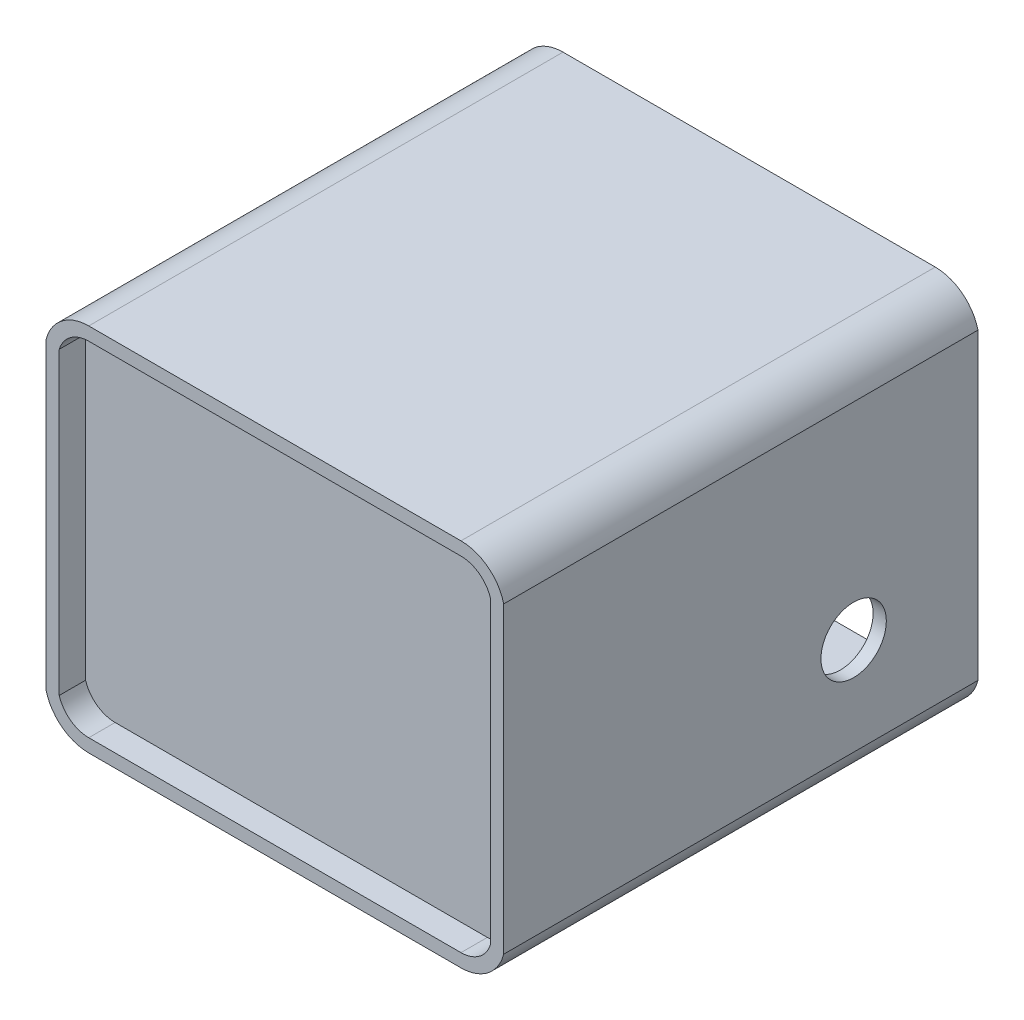
ISO-10303-21;
HEADER;
FILE_DESCRIPTION(('STEP AP214'),'2;1');
FILE_NAME('part.step','',(''),(''),'','','');
FILE_SCHEMA(('AUTOMOTIVE_DESIGN { 1 0 10303 214 1 1 1 1 }'));
ENDSEC;
DATA;
#1=APPLICATION_CONTEXT('core data for automotive mechanical design processes');
#2=APPLICATION_PROTOCOL_DEFINITION('international standard','automotive_design',2000,#1);
#3=PRODUCT_CONTEXT('',#1,'mechanical');
#4=PRODUCT('Part','Part','',(#3));
#5=PRODUCT_RELATED_PRODUCT_CATEGORY('part','',(#4));
#6=PRODUCT_DEFINITION_FORMATION('','',#4);
#7=PRODUCT_DEFINITION_CONTEXT('part definition',#1,'design');
#8=PRODUCT_DEFINITION('design','',#6,#7);
#9=PRODUCT_DEFINITION_SHAPE('','',#8);
#10=(LENGTH_UNIT() NAMED_UNIT(*) SI_UNIT(.MILLI.,.METRE.));
#11=(NAMED_UNIT(*) PLANE_ANGLE_UNIT() SI_UNIT($,.RADIAN.));
#12=(NAMED_UNIT(*) SI_UNIT($,.STERADIAN.) SOLID_ANGLE_UNIT());
#13=UNCERTAINTY_MEASURE_WITH_UNIT(LENGTH_MEASURE(1.E-05),#10,'distance_accuracy_value','');
#14=(GEOMETRIC_REPRESENTATION_CONTEXT(3) GLOBAL_UNCERTAINTY_ASSIGNED_CONTEXT((#13)) GLOBAL_UNIT_ASSIGNED_CONTEXT((#10,
#11,#12)) REPRESENTATION_CONTEXT('',''));
#15=CARTESIAN_POINT('',(0.,0.,0.));
#16=DIRECTION('',(0.,0.,1.));
#17=DIRECTION('',(1.,0.,0.));
#18=AXIS2_PLACEMENT_3D('',#15,#16,#17);
#19=CARTESIAN_POINT('',(-90.736928,619.21307254306,-231.201214));
#20=DIRECTION('',(0.,0.,1.));
#21=DIRECTION('',(1.,0.,0.));
#22=AXIS2_PLACEMENT_3D('',#19,#20,#21);
#23=CYLINDRICAL_SURFACE('',#22,15.0628965430605);
#24=CARTESIAN_POINT('',(-90.736928,619.21307254306,-19.202654));
#25=DIRECTION('',(0.,0.,1.));
#26=DIRECTION('',(1.,0.,0.));
#27=AXIS2_PLACEMENT_3D('',#24,#25,#26);
#28=CIRCLE('',#27,15.0628965430605);
#29=CARTESIAN_POINT('',(-90.736928,604.150176,-19.202654));
#30=VERTEX_POINT('',#29);
#31=CARTESIAN_POINT('',(-105.136188,614.791289676462,-19.202654));
#32=VERTEX_POINT('',#31);
#33=EDGE_CURVE('E213',#30,#32,#28,.F.);
#34=ORIENTED_EDGE('',*,*,#33,.F.);
#35=DIRECTION('',(0.,0.,1.));
#36=VECTOR('',#35,1.);
#37=CARTESIAN_POINT('',(-90.736928,604.150176,-231.201214));
#38=LINE('',#37,#36);
#39=CARTESIAN_POINT('',(-90.736928,604.150176,-231.201214));
#40=VERTEX_POINT('',#39);
#41=EDGE_CURVE('E197',#40,#30,#38,.T.);
#42=ORIENTED_EDGE('',*,*,#41,.F.);
#43=CARTESIAN_POINT('',(-90.736928,619.21307254306,-231.201214));
#44=DIRECTION('',(0.,0.,1.));
#45=DIRECTION('',(-1.,0.,0.));
#46=AXIS2_PLACEMENT_3D('',#43,#44,#45);
#47=CIRCLE('',#46,15.0628965430605);
#48=CARTESIAN_POINT('',(-105.136188,614.791289676462,-231.201214));
#49=VERTEX_POINT('',#48);
#50=EDGE_CURVE('E256',#49,#40,#47,.T.);
#51=ORIENTED_EDGE('',*,*,#50,.F.);
#52=DIRECTION('',(0.,0.,1.));
#53=VECTOR('',#52,1.);
#54=CARTESIAN_POINT('',(-105.136188,614.791289676462,-231.201214));
#55=LINE('',#54,#53);
#56=EDGE_CURVE('E214',#49,#32,#55,.T.);
#57=ORIENTED_EDGE('',*,*,#56,.T.);
#58=EDGE_LOOP('',(#34,#42,#51,#57));
#59=FACE_BOUND('',#58,.T.);
#60=ADVANCED_FACE('F35',(#59),#23,.F.);
#61=CARTESIAN_POINT('',(-105.136188,614.791289676462,-231.201214));
#62=DIRECTION('',(-1.,0.,0.));
#63=DIRECTION('',(0.,0.,1.));
#64=AXIS2_PLACEMENT_3D('',#61,#62,#63);
#65=PLANE('',#64);
#66=CARTESIAN_POINT('',(-105.136188,661.318972,-170.56862));
#67=DIRECTION('',(-1.,0.,0.));
#68=DIRECTION('',(0.,0.,1.));
#69=AXIS2_PLACEMENT_3D('',#66,#67,#68);
#70=CIRCLE('',#69,15.942437);
#71=CARTESIAN_POINT('',(-105.136188,661.318972,-154.626183));
#72=VERTEX_POINT('',#71);
#73=EDGE_CURVE('E236',#72,#72,#70,.T.);
#74=ORIENTED_EDGE('',*,*,#73,.T.);
#75=EDGE_LOOP('',(#74));
#76=FACE_BOUND('',#75,.T.);
#77=DIRECTION('',(0.,1.,0.));
#78=VECTOR('',#77,1.);
#79=CARTESIAN_POINT('',(-105.136188,0.,-19.202654));
#80=LINE('',#79,#78);
#81=CARTESIAN_POINT('',(-105.136188,760.916452345539,-19.202654));
#82=VERTEX_POINT('',#81);
#83=EDGE_CURVE('E52',#32,#82,#80,.T.);
#84=ORIENTED_EDGE('',*,*,#83,.F.);
#85=ORIENTED_EDGE('',*,*,#56,.F.);
#86=DIRECTION('',(0.,-1.,0.));
#87=VECTOR('',#86,1.);
#88=CARTESIAN_POINT('',(-105.136188,614.791289676462,-231.201214));
#89=LINE('',#88,#87);
#90=CARTESIAN_POINT('',(-105.136188,760.916452345539,-231.201214));
#91=VERTEX_POINT('',#90);
#92=EDGE_CURVE('E275',#91,#49,#89,.T.);
#93=ORIENTED_EDGE('',*,*,#92,.F.);
#94=DIRECTION('',(0.,0.,1.));
#95=VECTOR('',#94,1.);
#96=CARTESIAN_POINT('',(-105.136188,760.916452345539,-231.201214));
#97=LINE('',#96,#95);
#98=EDGE_CURVE('E303',#91,#82,#97,.T.);
#99=ORIENTED_EDGE('',*,*,#98,.T.);
#100=EDGE_LOOP('',(#84,#85,#93,#99));
#101=FACE_BOUND('',#100,.T.);
#102=ADVANCED_FACE('F424',(#76,#101),#65,.F.);
#103=CARTESIAN_POINT('',(-90.736928,756.494952551877,-231.201214));
#104=DIRECTION('',(0.,0.,1.));
#105=DIRECTION('',(1.,0.,0.));
#106=AXIS2_PLACEMENT_3D('',#103,#104,#105);
#107=CYLINDRICAL_SURFACE('',#106,15.0628134481229);
#108=CARTESIAN_POINT('',(-90.736928,756.494952551877,-19.202654));
#109=DIRECTION('',(0.,0.,1.));
#110=DIRECTION('',(1.,0.,0.));
#111=AXIS2_PLACEMENT_3D('',#108,#109,#110);
#112=CIRCLE('',#111,15.0628134481229);
#113=CARTESIAN_POINT('',(-90.736928,771.557766,-19.202654));
#114=VERTEX_POINT('',#113);
#115=EDGE_CURVE('E60',#82,#114,#112,.F.);
#116=ORIENTED_EDGE('',*,*,#115,.F.);
#117=ORIENTED_EDGE('',*,*,#98,.F.);
#118=CARTESIAN_POINT('',(-90.736928,756.494952551877,-231.201214));
#119=DIRECTION('',(0.,0.,1.));
#120=DIRECTION('',(-1.,0.,0.));
#121=AXIS2_PLACEMENT_3D('',#118,#119,#120);
#122=CIRCLE('',#121,15.0628134481229);
#123=CARTESIAN_POINT('',(-90.736928,771.557766,-231.201214));
#124=VERTEX_POINT('',#123);
#125=EDGE_CURVE('E272',#124,#91,#122,.T.);
#126=ORIENTED_EDGE('',*,*,#125,.F.);
#127=DIRECTION('',(0.,0.,1.));
#128=VECTOR('',#127,1.);
#129=CARTESIAN_POINT('',(-90.736928,771.557766,-231.201214));
#130=LINE('',#129,#128);
#131=EDGE_CURVE('E306',#124,#114,#130,.T.);
#132=ORIENTED_EDGE('',*,*,#131,.T.);
#133=EDGE_LOOP('',(#116,#117,#126,#132));
#134=FACE_BOUND('',#133,.T.);
#135=ADVANCED_FACE('F430',(#134),#107,.F.);
#136=CARTESIAN_POINT('',(-90.736928,771.557766,-231.201214));
#137=DIRECTION('',(0.,1.,0.));
#138=DIRECTION('',(-1.,0.,0.));
#139=AXIS2_PLACEMENT_3D('',#136,#137,#138);
#140=PLANE('',#139);
#141=DIRECTION('',(1.,0.,0.));
#142=VECTOR('',#141,1.);
#143=CARTESIAN_POINT('',(4.72064878796574E-13,771.557766,-19.202654));
#144=LINE('',#143,#142);
#145=CARTESIAN_POINT('',(90.721434,771.557766,-19.202654));
#146=VERTEX_POINT('',#145);
#147=EDGE_CURVE('E255',#114,#146,#144,.T.);
#148=ORIENTED_EDGE('',*,*,#147,.F.);
#149=ORIENTED_EDGE('',*,*,#131,.F.);
#150=DIRECTION('',(-1.,0.,0.));
#151=VECTOR('',#150,1.);
#152=CARTESIAN_POINT('',(-90.736928,771.557766,-231.201214));
#153=LINE('',#152,#151);
#154=CARTESIAN_POINT('',(90.721434,771.557766,-231.201214));
#155=VERTEX_POINT('',#154);
#156=EDGE_CURVE('E269',#155,#124,#153,.T.);
#157=ORIENTED_EDGE('',*,*,#156,.F.);
#158=DIRECTION('',(0.,0.,1.));
#159=VECTOR('',#158,1.);
#160=CARTESIAN_POINT('',(90.721434,771.557766,-231.201214));
#161=LINE('',#160,#159);
#162=EDGE_CURVE('E309',#155,#146,#161,.T.);
#163=ORIENTED_EDGE('',*,*,#162,.T.);
#164=EDGE_LOOP('',(#148,#149,#157,#163));
#165=FACE_BOUND('',#164,.T.);
#166=ADVANCED_FACE('F483',(#165),#140,.F.);
#167=CARTESIAN_POINT('',(90.721434,756.494625859581,-231.201214));
#168=DIRECTION('',(0.,0.,1.));
#169=DIRECTION('',(1.,0.,0.));
#170=AXIS2_PLACEMENT_3D('',#167,#168,#169);
#171=CYLINDRICAL_SURFACE('',#170,15.0631401404185);
#172=CARTESIAN_POINT('',(90.721434,756.494625859581,-19.202654));
#173=DIRECTION('',(0.,0.,1.));
#174=DIRECTION('',(1.,0.,0.));
#175=AXIS2_PLACEMENT_3D('',#172,#173,#174);
#176=CIRCLE('',#175,15.0631401404185);
#177=CARTESIAN_POINT('',(105.120948,760.916411409977,-19.202654));
#178=VERTEX_POINT('',#177);
#179=EDGE_CURVE('E228',#146,#178,#176,.F.);
#180=ORIENTED_EDGE('',*,*,#179,.F.);
#181=ORIENTED_EDGE('',*,*,#162,.F.);
#182=CARTESIAN_POINT('',(90.721434,756.494625859581,-231.201214));
#183=DIRECTION('',(0.,0.,1.));
#184=DIRECTION('',(-1.,0.,0.));
#185=AXIS2_PLACEMENT_3D('',#182,#183,#184);
#186=CIRCLE('',#185,15.0631401404185);
#187=CARTESIAN_POINT('',(105.120948,760.916411409977,-231.201214));
#188=VERTEX_POINT('',#187);
#189=EDGE_CURVE('E266',#188,#155,#186,.T.);
#190=ORIENTED_EDGE('',*,*,#189,.F.);
#191=DIRECTION('',(0.,0.,1.));
#192=VECTOR('',#191,1.);
#193=CARTESIAN_POINT('',(105.120948,760.916411409977,-231.201214));
#194=LINE('',#193,#192);
#195=EDGE_CURVE('E313',#188,#178,#194,.T.);
#196=ORIENTED_EDGE('',*,*,#195,.T.);
#197=EDGE_LOOP('',(#180,#181,#190,#196));
#198=FACE_BOUND('',#197,.T.);
#199=ADVANCED_FACE('F488',(#198),#171,.F.);
#200=CARTESIAN_POINT('',(105.120948,614.791330611854,-231.201214));
#201=DIRECTION('',(1.,0.,0.));
#202=DIRECTION('',(0.,0.,-1.));
#203=AXIS2_PLACEMENT_3D('',#200,#201,#202);
#204=PLANE('',#203);
#205=CARTESIAN_POINT('',(105.120948,661.318972,-170.56862));
#206=DIRECTION('',(1.,0.,0.));
#207=DIRECTION('',(0.,0.,-1.));
#208=AXIS2_PLACEMENT_3D('',#205,#206,#207);
#209=CIRCLE('',#208,15.942437);
#210=CARTESIAN_POINT('',(105.120948,661.318972,-186.511057));
#211=VERTEX_POINT('',#210);
#212=EDGE_CURVE('E529',#211,#211,#209,.T.);
#213=ORIENTED_EDGE('',*,*,#212,.T.);
#214=EDGE_LOOP('',(#213));
#215=FACE_BOUND('',#214,.T.);
#216=DIRECTION('',(0.,1.,0.));
#217=VECTOR('',#216,1.);
#218=CARTESIAN_POINT('',(105.120948,0.,-19.202654));
#219=LINE('',#218,#217);
#220=CARTESIAN_POINT('',(105.120948,614.791330611854,-19.202654));
#221=VERTEX_POINT('',#220);
#222=EDGE_CURVE('E223',#221,#178,#219,.T.);
#223=ORIENTED_EDGE('',*,*,#222,.T.);
#224=ORIENTED_EDGE('',*,*,#195,.F.);
#225=DIRECTION('',(0.,1.,0.));
#226=VECTOR('',#225,1.);
#227=CARTESIAN_POINT('',(105.120948,614.791330611854,-231.201214));
#228=LINE('',#227,#226);
#229=CARTESIAN_POINT('',(105.120948,614.791330611854,-231.201214));
#230=VERTEX_POINT('',#229);
#231=EDGE_CURVE('E263',#230,#188,#228,.T.);
#232=ORIENTED_EDGE('',*,*,#231,.F.);
#233=DIRECTION('',(0.,0.,1.));
#234=VECTOR('',#233,1.);
#235=CARTESIAN_POINT('',(105.120948,614.791330611854,-231.201214));
#236=LINE('',#235,#234);
#237=EDGE_CURVE('E317',#230,#221,#236,.T.);
#238=ORIENTED_EDGE('',*,*,#237,.T.);
#239=EDGE_LOOP('',(#223,#224,#232,#238));
#240=FACE_BOUND('',#239,.T.);
#241=ADVANCED_FACE('F493',(#215,#240),#204,.F.);
#242=CARTESIAN_POINT('',(90.721434,619.213399240477,-231.201214));
#243=DIRECTION('',(0.,0.,1.));
#244=DIRECTION('',(1.,0.,0.));
#245=AXIS2_PLACEMENT_3D('',#242,#243,#244);
#246=CYLINDRICAL_SURFACE('',#245,15.0632232404772);
#247=CARTESIAN_POINT('',(90.721434,619.213399240477,-19.202654));
#248=DIRECTION('',(0.,0.,1.));
#249=DIRECTION('',(1.,0.,0.));
#250=AXIS2_PLACEMENT_3D('',#247,#248,#249);
#251=CIRCLE('',#250,15.0632232404772);
#252=CARTESIAN_POINT('',(90.721434,604.150176,-19.202654));
#253=VERTEX_POINT('',#252);
#254=EDGE_CURVE('E221',#221,#253,#251,.F.);
#255=ORIENTED_EDGE('',*,*,#254,.F.);
#256=ORIENTED_EDGE('',*,*,#237,.F.);
#257=CARTESIAN_POINT('',(90.721434,619.213399240477,-231.201214));
#258=DIRECTION('',(0.,0.,1.));
#259=DIRECTION('',(-1.,0.,0.));
#260=AXIS2_PLACEMENT_3D('',#257,#258,#259);
#261=CIRCLE('',#260,15.0632232404772);
#262=CARTESIAN_POINT('',(90.721434,604.150176,-231.201214));
#263=VERTEX_POINT('',#262);
#264=EDGE_CURVE('E260',#263,#230,#261,.T.);
#265=ORIENTED_EDGE('',*,*,#264,.F.);
#266=DIRECTION('',(0.,0.,1.));
#267=VECTOR('',#266,1.);
#268=CARTESIAN_POINT('',(90.721434,604.150176,-231.201214));
#269=LINE('',#268,#267);
#270=EDGE_CURVE('E321',#263,#253,#269,.T.);
#271=ORIENTED_EDGE('',*,*,#270,.T.);
#272=EDGE_LOOP('',(#255,#256,#265,#271));
#273=FACE_BOUND('',#272,.T.);
#274=ADVANCED_FACE('F501',(#273),#246,.F.);
#275=CARTESIAN_POINT('',(-90.736928,604.150176,-231.201214));
#276=DIRECTION('',(0.,-1.,0.));
#277=DIRECTION('',(0.,0.,-1.));
#278=AXIS2_PLACEMENT_3D('',#275,#276,#277);
#279=PLANE('',#278);
#280=DIRECTION('',(1.,0.,0.));
#281=VECTOR('',#280,1.);
#282=CARTESIAN_POINT('',(0.,604.150176,-19.202654));
#283=LINE('',#282,#281);
#284=EDGE_CURVE('E202',#30,#253,#283,.T.);
#285=ORIENTED_EDGE('',*,*,#284,.T.);
#286=ORIENTED_EDGE('',*,*,#270,.F.);
#287=DIRECTION('',(1.,0.,0.));
#288=VECTOR('',#287,1.);
#289=CARTESIAN_POINT('',(-90.736928,604.150176,-231.201214));
#290=LINE('',#289,#288);
#291=EDGE_CURVE('E205',#40,#263,#290,.T.);
#292=ORIENTED_EDGE('',*,*,#291,.F.);
#293=ORIENTED_EDGE('',*,*,#41,.T.);
#294=EDGE_LOOP('',(#285,#286,#292,#293));
#295=FACE_BOUND('',#294,.T.);
#296=ADVANCED_FACE('F199',(#295),#279,.F.);
#297=CARTESIAN_POINT('',(-90.736928,619.21307254306,-231.201214));
#298=DIRECTION('',(0.,0.,1.));
#299=DIRECTION('',(1.,0.,0.));
#300=AXIS2_PLACEMENT_3D('',#297,#298,#299);
#301=CYLINDRICAL_SURFACE('',#300,21.5048445430605);
#302=CARTESIAN_POINT('',(-90.736928,619.21307254306,0.));
#303=DIRECTION('',(0.,0.,1.));
#304=DIRECTION('',(-1.,0.,0.));
#305=AXIS2_PLACEMENT_3D('',#302,#303,#304);
#306=CIRCLE('',#305,21.5048445430605);
#307=CARTESIAN_POINT('',(-111.578136,613.911904,0.));
#308=VERTEX_POINT('',#307);
#309=CARTESIAN_POINT('',(-90.736928,597.708228,0.));
#310=VERTEX_POINT('',#309);
#311=EDGE_CURVE('E301',#308,#310,#306,.T.);
#312=ORIENTED_EDGE('',*,*,#311,.F.);
#313=DIRECTION('',(0.,0.,1.));
#314=VECTOR('',#313,1.);
#315=CARTESIAN_POINT('',(-111.578136,613.911904,-231.201214));
#316=LINE('',#315,#314);
#317=CARTESIAN_POINT('',(-111.578136,613.911904,-231.201214));
#318=VERTEX_POINT('',#317);
#319=EDGE_CURVE('E11',#318,#308,#316,.T.);
#320=ORIENTED_EDGE('',*,*,#319,.F.);
#321=CARTESIAN_POINT('',(-90.736928,619.21307254306,-231.201214));
#322=DIRECTION('',(0.,0.,1.));
#323=DIRECTION('',(-1.,0.,0.));
#324=AXIS2_PLACEMENT_3D('',#321,#322,#323);
#325=CIRCLE('',#324,21.5048445430605);
#326=CARTESIAN_POINT('',(-90.736928,597.708228,-231.201214));
#327=VERTEX_POINT('',#326);
#328=EDGE_CURVE('E323',#318,#327,#325,.T.);
#329=ORIENTED_EDGE('',*,*,#328,.T.);
#330=DIRECTION('',(0.,0.,1.));
#331=VECTOR('',#330,1.);
#332=CARTESIAN_POINT('',(-90.736928,597.708228,-231.201214));
#333=LINE('',#332,#331);
#334=EDGE_CURVE('E39',#327,#310,#333,.T.);
#335=ORIENTED_EDGE('',*,*,#334,.T.);
#336=EDGE_LOOP('',(#312,#320,#329,#335));
#337=FACE_BOUND('',#336,.T.);
#338=ADVANCED_FACE('F37',(#337),#301,.T.);
#339=CARTESIAN_POINT('',(-111.578136,613.911904,-231.201214));
#340=DIRECTION('',(-1.,0.,0.));
#341=DIRECTION('',(0.,0.,1.));
#342=AXIS2_PLACEMENT_3D('',#339,#340,#341);
#343=PLANE('',#342);
#344=CARTESIAN_POINT('',(-111.578136,661.318972,-170.56862));
#345=DIRECTION('',(1.,0.,0.));
#346=DIRECTION('',(0.,0.,-1.));
#347=AXIS2_PLACEMENT_3D('',#344,#345,#346);
#348=CIRCLE('',#347,15.942437);
#349=CARTESIAN_POINT('',(-111.578136,661.318972,-186.511057));
#350=VERTEX_POINT('',#349);
#351=EDGE_CURVE('E532',#350,#350,#348,.T.);
#352=ORIENTED_EDGE('',*,*,#351,.T.);
#353=EDGE_LOOP('',(#352));
#354=FACE_BOUND('',#353,.T.);
#355=DIRECTION('',(0.,-1.,0.));
#356=VECTOR('',#355,1.);
#357=CARTESIAN_POINT('',(-111.578136,613.911904,0.));
#358=LINE('',#357,#356);
#359=CARTESIAN_POINT('',(-111.578136,761.795784,0.));
#360=VERTEX_POINT('',#359);
#361=EDGE_CURVE('E327',#360,#308,#358,.T.);
#362=ORIENTED_EDGE('',*,*,#361,.F.);
#363=DIRECTION('',(0.,0.,1.));
#364=VECTOR('',#363,1.);
#365=CARTESIAN_POINT('',(-111.578136,761.795784,-231.201214));
#366=LINE('',#365,#364);
#367=CARTESIAN_POINT('',(-111.578136,761.795784,-231.201214));
#368=VERTEX_POINT('',#367);
#369=EDGE_CURVE('E44',#368,#360,#366,.T.);
#370=ORIENTED_EDGE('',*,*,#369,.F.);
#371=DIRECTION('',(0.,-1.,0.));
#372=VECTOR('',#371,1.);
#373=CARTESIAN_POINT('',(-111.578136,613.911904,-231.201214));
#374=LINE('',#373,#372);
#375=EDGE_CURVE('E345',#368,#318,#374,.T.);
#376=ORIENTED_EDGE('',*,*,#375,.T.);
#377=ORIENTED_EDGE('',*,*,#319,.T.);
#378=EDGE_LOOP('',(#362,#370,#376,#377));
#379=FACE_BOUND('',#378,.T.);
#380=ADVANCED_FACE('F392',(#354,#379),#343,.T.);
#381=CARTESIAN_POINT('',(-90.736928,756.494952551877,-231.201214));
#382=DIRECTION('',(0.,0.,1.));
#383=DIRECTION('',(1.,0.,0.));
#384=AXIS2_PLACEMENT_3D('',#381,#382,#383);
#385=CYLINDRICAL_SURFACE('',#384,21.5047614481229);
#386=CARTESIAN_POINT('',(-90.736928,756.494952551877,0.));
#387=DIRECTION('',(0.,0.,1.));
#388=DIRECTION('',(-1.,0.,0.));
#389=AXIS2_PLACEMENT_3D('',#386,#387,#388);
#390=CIRCLE('',#389,21.5047614481229);
#391=CARTESIAN_POINT('',(-90.736928,777.999714,0.));
#392=VERTEX_POINT('',#391);
#393=EDGE_CURVE('E365',#392,#360,#390,.T.);
#394=ORIENTED_EDGE('',*,*,#393,.F.);
#395=DIRECTION('',(0.,0.,1.));
#396=VECTOR('',#395,1.);
#397=CARTESIAN_POINT('',(-90.736928,777.999714,-231.201214));
#398=LINE('',#397,#396);
#399=CARTESIAN_POINT('',(-90.736928,777.999714,-231.201214));
#400=VERTEX_POINT('',#399);
#401=EDGE_CURVE('E371',#400,#392,#398,.T.);
#402=ORIENTED_EDGE('',*,*,#401,.F.);
#403=CARTESIAN_POINT('',(-90.736928,756.494952551877,-231.201214));
#404=DIRECTION('',(0.,0.,1.));
#405=DIRECTION('',(-1.,0.,0.));
#406=AXIS2_PLACEMENT_3D('',#403,#404,#405);
#407=CIRCLE('',#406,21.5047614481229);
#408=EDGE_CURVE('E342',#400,#368,#407,.T.);
#409=ORIENTED_EDGE('',*,*,#408,.T.);
#410=ORIENTED_EDGE('',*,*,#369,.T.);
#411=EDGE_LOOP('',(#394,#402,#409,#410));
#412=FACE_BOUND('',#411,.T.);
#413=ADVANCED_FACE('F413',(#412),#385,.T.);
#414=CARTESIAN_POINT('',(-90.736928,777.999714,-231.201214));
#415=DIRECTION('',(0.,1.,0.));
#416=DIRECTION('',(0.,0.,1.));
#417=AXIS2_PLACEMENT_3D('',#414,#415,#416);
#418=PLANE('',#417);
#419=DIRECTION('',(-1.,0.,0.));
#420=VECTOR('',#419,1.);
#421=CARTESIAN_POINT('',(-90.736928,777.999714,0.));
#422=LINE('',#421,#420);
#423=CARTESIAN_POINT('',(90.721434,777.999714,0.));
#424=VERTEX_POINT('',#423);
#425=EDGE_CURVE('E362',#424,#392,#422,.T.);
#426=ORIENTED_EDGE('',*,*,#425,.F.);
#427=DIRECTION('',(0.,0.,1.));
#428=VECTOR('',#427,1.);
#429=CARTESIAN_POINT('',(90.721434,777.999714,-231.201214));
#430=LINE('',#429,#428);
#431=CARTESIAN_POINT('',(90.721434,777.999714,-231.201214));
#432=VERTEX_POINT('',#431);
#433=EDGE_CURVE('E373',#432,#424,#430,.T.);
#434=ORIENTED_EDGE('',*,*,#433,.F.);
#435=DIRECTION('',(-1.,0.,0.));
#436=VECTOR('',#435,1.);
#437=CARTESIAN_POINT('',(-90.736928,777.999714,-231.201214));
#438=LINE('',#437,#436);
#439=EDGE_CURVE('E339',#432,#400,#438,.T.);
#440=ORIENTED_EDGE('',*,*,#439,.T.);
#441=ORIENTED_EDGE('',*,*,#401,.T.);
#442=EDGE_LOOP('',(#426,#434,#440,#441));
#443=FACE_BOUND('',#442,.T.);
#444=ADVANCED_FACE('F411',(#443),#418,.T.);
#445=CARTESIAN_POINT('',(90.721434,756.494625859581,-231.201214));
#446=DIRECTION('',(0.,0.,1.));
#447=DIRECTION('',(1.,0.,0.));
#448=AXIS2_PLACEMENT_3D('',#445,#446,#447);
#449=CYLINDRICAL_SURFACE('',#448,21.5050881404186);
#450=CARTESIAN_POINT('',(90.721434,756.494625859581,0.));
#451=DIRECTION('',(0.,0.,1.));
#452=DIRECTION('',(-1.,0.,0.));
#453=AXIS2_PLACEMENT_3D('',#450,#451,#452);
#454=CIRCLE('',#453,21.5050881404186);
#455=CARTESIAN_POINT('',(111.562896,761.795784,0.));
#456=VERTEX_POINT('',#455);
#457=EDGE_CURVE('E359',#456,#424,#454,.T.);
#458=ORIENTED_EDGE('',*,*,#457,.F.);
#459=DIRECTION('',(0.,0.,1.));
#460=VECTOR('',#459,1.);
#461=CARTESIAN_POINT('',(111.562896,761.795784,-231.201214));
#462=LINE('',#461,#460);
#463=CARTESIAN_POINT('',(111.562896,761.795784,-231.201214));
#464=VERTEX_POINT('',#463);
#465=EDGE_CURVE('E375',#464,#456,#462,.T.);
#466=ORIENTED_EDGE('',*,*,#465,.F.);
#467=CARTESIAN_POINT('',(90.721434,756.494625859581,-231.201214));
#468=DIRECTION('',(0.,0.,1.));
#469=DIRECTION('',(-1.,0.,0.));
#470=AXIS2_PLACEMENT_3D('',#467,#468,#469);
#471=CIRCLE('',#470,21.5050881404186);
#472=EDGE_CURVE('E336',#464,#432,#471,.T.);
#473=ORIENTED_EDGE('',*,*,#472,.T.);
#474=ORIENTED_EDGE('',*,*,#433,.T.);
#475=EDGE_LOOP('',(#458,#466,#473,#474));
#476=FACE_BOUND('',#475,.T.);
#477=ADVANCED_FACE('F407',(#476),#449,.T.);
#478=CARTESIAN_POINT('',(111.562896,613.911904,-231.201214));
#479=DIRECTION('',(1.,0.,0.));
#480=DIRECTION('',(0.,0.,-1.));
#481=AXIS2_PLACEMENT_3D('',#478,#479,#480);
#482=PLANE('',#481);
#483=CARTESIAN_POINT('',(111.562896,661.318972,-170.56862));
#484=DIRECTION('',(1.,0.,0.));
#485=DIRECTION('',(0.,0.,-1.));
#486=AXIS2_PLACEMENT_3D('',#483,#484,#485);
#487=CIRCLE('',#486,15.942437);
#488=CARTESIAN_POINT('',(111.562896,661.318972,-186.511057));
#489=VERTEX_POINT('',#488);
#490=EDGE_CURVE('E533',#489,#489,#487,.T.);
#491=ORIENTED_EDGE('',*,*,#490,.F.);
#492=EDGE_LOOP('',(#491));
#493=FACE_BOUND('',#492,.T.);
#494=DIRECTION('',(0.,1.,0.));
#495=VECTOR('',#494,1.);
#496=CARTESIAN_POINT('',(111.562896,613.911904,0.));
#497=LINE('',#496,#495);
#498=CARTESIAN_POINT('',(111.562896,613.911904,0.));
#499=VERTEX_POINT('',#498);
#500=EDGE_CURVE('E356',#499,#456,#497,.T.);
#501=ORIENTED_EDGE('',*,*,#500,.F.);
#502=DIRECTION('',(0.,0.,1.));
#503=VECTOR('',#502,1.);
#504=CARTESIAN_POINT('',(111.562896,613.911904,-231.201214));
#505=LINE('',#504,#503);
#506=CARTESIAN_POINT('',(111.562896,613.911904,-231.201214));
#507=VERTEX_POINT('',#506);
#508=EDGE_CURVE('E377',#507,#499,#505,.T.);
#509=ORIENTED_EDGE('',*,*,#508,.F.);
#510=DIRECTION('',(0.,1.,0.));
#511=VECTOR('',#510,1.);
#512=CARTESIAN_POINT('',(111.562896,613.911904,-231.201214));
#513=LINE('',#512,#511);
#514=EDGE_CURVE('E333',#507,#464,#513,.T.);
#515=ORIENTED_EDGE('',*,*,#514,.T.);
#516=ORIENTED_EDGE('',*,*,#465,.T.);
#517=EDGE_LOOP('',(#501,#509,#515,#516));
#518=FACE_BOUND('',#517,.T.);
#519=ADVANCED_FACE('F405',(#493,#518),#482,.T.);
#520=CARTESIAN_POINT('',(90.721434,619.213399240477,-231.201214));
#521=DIRECTION('',(0.,0.,1.));
#522=DIRECTION('',(1.,0.,0.));
#523=AXIS2_PLACEMENT_3D('',#520,#521,#522);
#524=CYLINDRICAL_SURFACE('',#523,21.5051712404772);
#525=CARTESIAN_POINT('',(90.721434,619.213399240477,0.));
#526=DIRECTION('',(0.,0.,1.));
#527=DIRECTION('',(-1.,0.,0.));
#528=AXIS2_PLACEMENT_3D('',#525,#526,#527);
#529=CIRCLE('',#528,21.5051712404772);
#530=CARTESIAN_POINT('',(90.721434,597.708228,0.));
#531=VERTEX_POINT('',#530);
#532=EDGE_CURVE('E353',#531,#499,#529,.T.);
#533=ORIENTED_EDGE('',*,*,#532,.F.);
#534=DIRECTION('',(0.,0.,1.));
#535=VECTOR('',#534,1.);
#536=CARTESIAN_POINT('',(90.721434,597.708228,-231.201214));
#537=LINE('',#536,#535);
#538=CARTESIAN_POINT('',(90.721434,597.708228,-231.201214));
#539=VERTEX_POINT('',#538);
#540=EDGE_CURVE('E378',#539,#531,#537,.T.);
#541=ORIENTED_EDGE('',*,*,#540,.F.);
#542=CARTESIAN_POINT('',(90.721434,619.213399240477,-231.201214));
#543=DIRECTION('',(0.,0.,1.));
#544=DIRECTION('',(-1.,0.,0.));
#545=AXIS2_PLACEMENT_3D('',#542,#543,#544);
#546=CIRCLE('',#545,21.5051712404772);
#547=EDGE_CURVE('E330',#539,#507,#546,.T.);
#548=ORIENTED_EDGE('',*,*,#547,.T.);
#549=ORIENTED_EDGE('',*,*,#508,.T.);
#550=EDGE_LOOP('',(#533,#541,#548,#549));
#551=FACE_BOUND('',#550,.T.);
#552=ADVANCED_FACE('F401',(#551),#524,.T.);
#553=CARTESIAN_POINT('',(-90.736928,597.708228,-231.201214));
#554=DIRECTION('',(0.,-1.,0.));
#555=DIRECTION('',(0.,0.,-1.));
#556=AXIS2_PLACEMENT_3D('',#553,#554,#555);
#557=PLANE('',#556);
#558=DIRECTION('',(1.,0.,0.));
#559=VECTOR('',#558,1.);
#560=CARTESIAN_POINT('',(-90.736928,597.708228,0.));
#561=LINE('',#560,#559);
#562=EDGE_CURVE('E350',#310,#531,#561,.T.);
#563=ORIENTED_EDGE('',*,*,#562,.F.);
#564=ORIENTED_EDGE('',*,*,#334,.F.);
#565=DIRECTION('',(1.,0.,0.));
#566=VECTOR('',#565,1.);
#567=CARTESIAN_POINT('',(-90.736928,597.708228,-231.201214));
#568=LINE('',#567,#566);
#569=EDGE_CURVE('E326',#327,#539,#568,.T.);
#570=ORIENTED_EDGE('',*,*,#569,.T.);
#571=ORIENTED_EDGE('',*,*,#540,.T.);
#572=EDGE_LOOP('',(#563,#564,#570,#571));
#573=FACE_BOUND('',#572,.T.);
#574=ADVANCED_FACE('F386',(#573),#557,.T.);
#575=CARTESIAN_POINT('',(-90.736928,619.21307254306,-231.201214));
#576=DIRECTION('',(0.,0.,-1.));
#577=DIRECTION('',(-1.,0.,0.));
#578=AXIS2_PLACEMENT_3D('',#575,#576,#577);
#579=PLANE('',#578);
#580=ORIENTED_EDGE('',*,*,#50,.T.);
#581=ORIENTED_EDGE('',*,*,#291,.T.);
#582=ORIENTED_EDGE('',*,*,#264,.T.);
#583=ORIENTED_EDGE('',*,*,#231,.T.);
#584=ORIENTED_EDGE('',*,*,#189,.T.);
#585=ORIENTED_EDGE('',*,*,#156,.T.);
#586=ORIENTED_EDGE('',*,*,#125,.T.);
#587=ORIENTED_EDGE('',*,*,#92,.T.);
#588=EDGE_LOOP('',(#580,#581,#582,#583,#584,#585,#586,#587));
#589=FACE_BOUND('',#588,.T.);
#590=ORIENTED_EDGE('',*,*,#328,.F.);
#591=ORIENTED_EDGE('',*,*,#375,.F.);
#592=ORIENTED_EDGE('',*,*,#408,.F.);
#593=ORIENTED_EDGE('',*,*,#439,.F.);
#594=ORIENTED_EDGE('',*,*,#472,.F.);
#595=ORIENTED_EDGE('',*,*,#514,.F.);
#596=ORIENTED_EDGE('',*,*,#547,.F.);
#597=ORIENTED_EDGE('',*,*,#569,.F.);
#598=EDGE_LOOP('',(#590,#591,#592,#593,#594,#595,#596,#597));
#599=FACE_BOUND('',#598,.T.);
#600=ADVANCED_FACE('F395',(#589,#599),#579,.T.);
#601=CARTESIAN_POINT('',(-90.736928,619.21307254306,0.));
#602=DIRECTION('',(0.,0.,-1.));
#603=DIRECTION('',(-1.,0.,0.));
#604=AXIS2_PLACEMENT_3D('',#601,#602,#603);
#605=PLANE('',#604);
#606=DIRECTION('',(1.,0.,0.));
#607=VECTOR('',#606,1.);
#608=CARTESIAN_POINT('',(-90.736928,604.150176,0.));
#609=LINE('',#608,#607);
#610=CARTESIAN_POINT('',(-90.736928,604.150176,0.));
#611=VERTEX_POINT('',#610);
#612=CARTESIAN_POINT('',(90.721434,604.150176,0.));
#613=VERTEX_POINT('',#612);
#614=EDGE_CURVE('E280',#611,#613,#609,.T.);
#615=ORIENTED_EDGE('',*,*,#614,.F.);
#616=CARTESIAN_POINT('',(-90.736928,619.21307254306,0.));
#617=DIRECTION('',(0.,0.,1.));
#618=DIRECTION('',(-1.,0.,0.));
#619=AXIS2_PLACEMENT_3D('',#616,#617,#618);
#620=CIRCLE('',#619,15.0628965430605);
#621=CARTESIAN_POINT('',(-105.136188,614.791289676462,0.));
#622=VERTEX_POINT('',#621);
#623=EDGE_CURVE('E231',#622,#611,#620,.T.);
#624=ORIENTED_EDGE('',*,*,#623,.F.);
#625=DIRECTION('',(0.,-1.,0.));
#626=VECTOR('',#625,1.);
#627=CARTESIAN_POINT('',(-105.136188,614.791289676462,0.));
#628=LINE('',#627,#626);
#629=CARTESIAN_POINT('',(-105.136188,760.916452345539,0.));
#630=VERTEX_POINT('',#629);
#631=EDGE_CURVE('E258',#630,#622,#628,.T.);
#632=ORIENTED_EDGE('',*,*,#631,.F.);
#633=CARTESIAN_POINT('',(-90.736928,756.494952551877,0.));
#634=DIRECTION('',(0.,0.,1.));
#635=DIRECTION('',(-1.,0.,0.));
#636=AXIS2_PLACEMENT_3D('',#633,#634,#635);
#637=CIRCLE('',#636,15.0628134481229);
#638=CARTESIAN_POINT('',(-90.736928,771.557766,0.));
#639=VERTEX_POINT('',#638);
#640=EDGE_CURVE('E295',#639,#630,#637,.T.);
#641=ORIENTED_EDGE('',*,*,#640,.F.);
#642=DIRECTION('',(-1.,0.,0.));
#643=VECTOR('',#642,1.);
#644=CARTESIAN_POINT('',(-90.736928,771.557766,0.));
#645=LINE('',#644,#643);
#646=CARTESIAN_POINT('',(90.721434,771.557766,0.));
#647=VERTEX_POINT('',#646);
#648=EDGE_CURVE('E292',#647,#639,#645,.T.);
#649=ORIENTED_EDGE('',*,*,#648,.F.);
#650=CARTESIAN_POINT('',(90.721434,756.494625859581,0.));
#651=DIRECTION('',(0.,0.,1.));
#652=DIRECTION('',(-1.,0.,0.));
#653=AXIS2_PLACEMENT_3D('',#650,#651,#652);
#654=CIRCLE('',#653,15.0631401404185);
#655=CARTESIAN_POINT('',(105.120948,760.916411409977,0.));
#656=VERTEX_POINT('',#655);
#657=EDGE_CURVE('E289',#656,#647,#654,.T.);
#658=ORIENTED_EDGE('',*,*,#657,.F.);
#659=DIRECTION('',(0.,1.,0.));
#660=VECTOR('',#659,1.);
#661=CARTESIAN_POINT('',(105.120948,614.791330611854,0.));
#662=LINE('',#661,#660);
#663=CARTESIAN_POINT('',(105.120948,614.791330611854,0.));
#664=VERTEX_POINT('',#663);
#665=EDGE_CURVE('E286',#664,#656,#662,.T.);
#666=ORIENTED_EDGE('',*,*,#665,.F.);
#667=CARTESIAN_POINT('',(90.721434,619.213399240477,0.));
#668=DIRECTION('',(0.,0.,1.));
#669=DIRECTION('',(-1.,0.,0.));
#670=AXIS2_PLACEMENT_3D('',#667,#668,#669);
#671=CIRCLE('',#670,15.0632232404772);
#672=EDGE_CURVE('E283',#613,#664,#671,.T.);
#673=ORIENTED_EDGE('',*,*,#672,.F.);
#674=EDGE_LOOP('',(#615,#624,#632,#641,#649,#658,#666,#673));
#675=FACE_BOUND('',#674,.T.);
#676=ORIENTED_EDGE('',*,*,#311,.T.);
#677=ORIENTED_EDGE('',*,*,#562,.T.);
#678=ORIENTED_EDGE('',*,*,#532,.T.);
#679=ORIENTED_EDGE('',*,*,#500,.T.);
#680=ORIENTED_EDGE('',*,*,#457,.T.);
#681=ORIENTED_EDGE('',*,*,#425,.T.);
#682=ORIENTED_EDGE('',*,*,#393,.T.);
#683=ORIENTED_EDGE('',*,*,#361,.T.);
#684=EDGE_LOOP('',(#676,#677,#678,#679,#680,#681,#682,#683));
#685=FACE_BOUND('',#684,.T.);
#686=ADVANCED_FACE('F388',(#675,#685),#605,.F.);
#687=CARTESIAN_POINT('',(-90.736928,604.150176,-12.852654));
#688=VERTEX_POINT('',#687);
#689=EDGE_CURVE('E210',#688,#611,#38,.T.);
#690=ORIENTED_EDGE('',*,*,#689,.F.);
#691=CARTESIAN_POINT('',(-90.736928,619.21307254306,-12.852654));
#692=DIRECTION('',(0.,0.,1.));
#693=DIRECTION('',(1.,0.,0.));
#694=AXIS2_PLACEMENT_3D('',#691,#692,#693);
#695=CIRCLE('',#694,15.0628965430605);
#696=CARTESIAN_POINT('',(-105.136188,614.791289676462,-12.852654));
#697=VERTEX_POINT('',#696);
#698=EDGE_CURVE('E242',#688,#697,#695,.F.);
#699=ORIENTED_EDGE('',*,*,#698,.T.);
#700=EDGE_CURVE('E302',#697,#622,#55,.T.);
#701=ORIENTED_EDGE('',*,*,#700,.T.);
#702=ORIENTED_EDGE('',*,*,#623,.T.);
#703=EDGE_LOOP('',(#690,#699,#701,#702));
#704=FACE_BOUND('',#703,.T.);
#705=ADVANCED_FACE('F426',(#704),#23,.F.);
#706=ORIENTED_EDGE('',*,*,#700,.F.);
#707=DIRECTION('',(0.,1.,0.));
#708=VECTOR('',#707,1.);
#709=CARTESIAN_POINT('',(-105.136188,0.,-12.852654));
#710=LINE('',#709,#708);
#711=CARTESIAN_POINT('',(-105.136188,760.916452345539,-12.852654));
#712=VERTEX_POINT('',#711);
#713=EDGE_CURVE('E239',#697,#712,#710,.T.);
#714=ORIENTED_EDGE('',*,*,#713,.T.);
#715=EDGE_CURVE('E305',#712,#630,#97,.T.);
#716=ORIENTED_EDGE('',*,*,#715,.T.);
#717=ORIENTED_EDGE('',*,*,#631,.T.);
#718=EDGE_LOOP('',(#706,#714,#716,#717));
#719=FACE_BOUND('',#718,.T.);
#720=ADVANCED_FACE('F433',(#719),#65,.F.);
#721=ORIENTED_EDGE('',*,*,#715,.F.);
#722=CARTESIAN_POINT('',(-90.736928,756.494952551877,-12.852654));
#723=DIRECTION('',(0.,0.,1.));
#724=DIRECTION('',(1.,0.,0.));
#725=AXIS2_PLACEMENT_3D('',#722,#723,#724);
#726=CIRCLE('',#725,15.0628134481229);
#727=CARTESIAN_POINT('',(-90.736928,771.557766,-12.852654));
#728=VERTEX_POINT('',#727);
#729=EDGE_CURVE('E235',#712,#728,#726,.F.);
#730=ORIENTED_EDGE('',*,*,#729,.T.);
#731=EDGE_CURVE('E308',#728,#639,#130,.T.);
#732=ORIENTED_EDGE('',*,*,#731,.T.);
#733=ORIENTED_EDGE('',*,*,#640,.T.);
#734=EDGE_LOOP('',(#721,#730,#732,#733));
#735=FACE_BOUND('',#734,.T.);
#736=ADVANCED_FACE('F442',(#735),#107,.F.);
#737=ORIENTED_EDGE('',*,*,#731,.F.);
#738=DIRECTION('',(1.,0.,0.));
#739=VECTOR('',#738,1.);
#740=CARTESIAN_POINT('',(4.72064878796574E-13,771.557766,-12.852654));
#741=LINE('',#740,#739);
#742=CARTESIAN_POINT('',(90.721434,771.557766,-12.852654));
#743=VERTEX_POINT('',#742);
#744=EDGE_CURVE('E232',#728,#743,#741,.T.);
#745=ORIENTED_EDGE('',*,*,#744,.T.);
#746=EDGE_CURVE('E312',#743,#647,#161,.T.);
#747=ORIENTED_EDGE('',*,*,#746,.T.);
#748=ORIENTED_EDGE('',*,*,#648,.T.);
#749=EDGE_LOOP('',(#737,#745,#747,#748));
#750=FACE_BOUND('',#749,.T.);
#751=ADVANCED_FACE('F472',(#750),#140,.F.);
#752=ORIENTED_EDGE('',*,*,#746,.F.);
#753=CARTESIAN_POINT('',(90.721434,756.494625859581,-12.852654));
#754=DIRECTION('',(0.,0.,1.));
#755=DIRECTION('',(1.,0.,0.));
#756=AXIS2_PLACEMENT_3D('',#753,#754,#755);
#757=CIRCLE('',#756,15.0631401404185);
#758=CARTESIAN_POINT('',(105.120948,760.916411409977,-12.852654));
#759=VERTEX_POINT('',#758);
#760=EDGE_CURVE('E252',#743,#759,#757,.F.);
#761=ORIENTED_EDGE('',*,*,#760,.T.);
#762=EDGE_CURVE('E316',#759,#656,#194,.T.);
#763=ORIENTED_EDGE('',*,*,#762,.T.);
#764=ORIENTED_EDGE('',*,*,#657,.T.);
#765=EDGE_LOOP('',(#752,#761,#763,#764));
#766=FACE_BOUND('',#765,.T.);
#767=ADVANCED_FACE('F468',(#766),#171,.F.);
#768=ORIENTED_EDGE('',*,*,#762,.F.);
#769=DIRECTION('',(0.,1.,0.));
#770=VECTOR('',#769,1.);
#771=CARTESIAN_POINT('',(105.120948,0.,-12.852654));
#772=LINE('',#771,#770);
#773=CARTESIAN_POINT('',(105.120948,614.791330611854,-12.852654));
#774=VERTEX_POINT('',#773);
#775=EDGE_CURVE('E250',#774,#759,#772,.T.);
#776=ORIENTED_EDGE('',*,*,#775,.F.);
#777=EDGE_CURVE('E320',#774,#664,#236,.T.);
#778=ORIENTED_EDGE('',*,*,#777,.T.);
#779=ORIENTED_EDGE('',*,*,#665,.T.);
#780=EDGE_LOOP('',(#768,#776,#778,#779));
#781=FACE_BOUND('',#780,.T.);
#782=ADVANCED_FACE('F464',(#781),#204,.F.);
#783=ORIENTED_EDGE('',*,*,#777,.F.);
#784=CARTESIAN_POINT('',(90.721434,619.213399240477,-12.852654));
#785=DIRECTION('',(0.,0.,1.));
#786=DIRECTION('',(1.,0.,0.));
#787=AXIS2_PLACEMENT_3D('',#784,#785,#786);
#788=CIRCLE('',#787,15.0632232404772);
#789=CARTESIAN_POINT('',(90.721434,604.150176,-12.852654));
#790=VERTEX_POINT('',#789);
#791=EDGE_CURVE('E247',#774,#790,#788,.F.);
#792=ORIENTED_EDGE('',*,*,#791,.T.);
#793=EDGE_CURVE('E209',#790,#613,#269,.T.);
#794=ORIENTED_EDGE('',*,*,#793,.T.);
#795=ORIENTED_EDGE('',*,*,#672,.T.);
#796=EDGE_LOOP('',(#783,#792,#794,#795));
#797=FACE_BOUND('',#796,.T.);
#798=ADVANCED_FACE('F460',(#797),#246,.F.);
#799=ORIENTED_EDGE('',*,*,#793,.F.);
#800=DIRECTION('',(1.,0.,0.));
#801=VECTOR('',#800,1.);
#802=CARTESIAN_POINT('',(0.,604.150176,-12.852654));
#803=LINE('',#802,#801);
#804=EDGE_CURVE('E245',#688,#790,#803,.T.);
#805=ORIENTED_EDGE('',*,*,#804,.F.);
#806=ORIENTED_EDGE('',*,*,#689,.T.);
#807=ORIENTED_EDGE('',*,*,#614,.T.);
#808=EDGE_LOOP('',(#799,#805,#806,#807));
#809=FACE_BOUND('',#808,.T.);
#810=ADVANCED_FACE('F453',(#809),#279,.F.);
#811=CARTESIAN_POINT('',(0.,0.,-12.852654));
#812=DIRECTION('',(0.,0.,1.));
#813=DIRECTION('',(1.,0.,0.));
#814=AXIS2_PLACEMENT_3D('',#811,#812,#813);
#815=PLANE('',#814);
#816=ORIENTED_EDGE('',*,*,#744,.F.);
#817=ORIENTED_EDGE('',*,*,#729,.F.);
#818=ORIENTED_EDGE('',*,*,#713,.F.);
#819=ORIENTED_EDGE('',*,*,#698,.F.);
#820=ORIENTED_EDGE('',*,*,#804,.T.);
#821=ORIENTED_EDGE('',*,*,#791,.F.);
#822=ORIENTED_EDGE('',*,*,#775,.T.);
#823=ORIENTED_EDGE('',*,*,#760,.F.);
#824=EDGE_LOOP('',(#816,#817,#818,#819,#820,#821,#822,#823));
#825=FACE_BOUND('',#824,.T.);
#826=ADVANCED_FACE('F456',(#825),#815,.T.);
#827=CARTESIAN_POINT('',(0.,0.,-19.202654));
#828=DIRECTION('',(0.,0.,1.));
#829=DIRECTION('',(1.,0.,0.));
#830=AXIS2_PLACEMENT_3D('',#827,#828,#829);
#831=PLANE('',#830);
#832=ORIENTED_EDGE('',*,*,#147,.T.);
#833=ORIENTED_EDGE('',*,*,#179,.T.);
#834=ORIENTED_EDGE('',*,*,#222,.F.);
#835=ORIENTED_EDGE('',*,*,#254,.T.);
#836=ORIENTED_EDGE('',*,*,#284,.F.);
#837=ORIENTED_EDGE('',*,*,#33,.T.);
#838=ORIENTED_EDGE('',*,*,#83,.T.);
#839=ORIENTED_EDGE('',*,*,#115,.T.);
#840=EDGE_LOOP('',(#832,#833,#834,#835,#836,#837,#838,#839));
#841=FACE_BOUND('',#840,.T.);
#842=ADVANCED_FACE('F219',(#841),#831,.F.);
#843=CARTESIAN_POINT('',(-111.578136,661.318972,-170.56862));
#844=DIRECTION('',(1.,0.,0.));
#845=DIRECTION('',(0.,0.,-1.));
#846=AXIS2_PLACEMENT_3D('',#843,#844,#845);
#847=CYLINDRICAL_SURFACE('',#846,15.942437);
#848=ORIENTED_EDGE('',*,*,#490,.T.);
#849=EDGE_LOOP('',(#848));
#850=FACE_BOUND('',#849,.T.);
#851=ORIENTED_EDGE('',*,*,#212,.F.);
#852=EDGE_LOOP('',(#851));
#853=FACE_BOUND('',#852,.T.);
#854=ADVANCED_FACE('F542',(#850,#853),#847,.F.);
#855=ORIENTED_EDGE('',*,*,#351,.F.);
#856=EDGE_LOOP('',(#855));
#857=FACE_BOUND('',#856,.T.);
#858=ORIENTED_EDGE('',*,*,#73,.F.);
#859=EDGE_LOOP('',(#858));
#860=FACE_BOUND('',#859,.T.);
#861=ADVANCED_FACE('F539',(#857,#860),#847,.F.);
#862=CLOSED_SHELL('',(#60,#102,#135,#166,#199,#241,#274,#296,#338,#380,#413,#444,#477,#519,#552,
#574,#600,#686,#705,#720,#736,#751,#767,#782,#798,#810,#826,#842,#854,#861));
#863=MANIFOLD_SOLID_BREP('B2',#862);
#864=ADVANCED_BREP_SHAPE_REPRESENTATION('',(#18,#863),#14);
#865=SHAPE_DEFINITION_REPRESENTATION(#9,#864);
ENDSEC;
END-ISO-10303-21;
